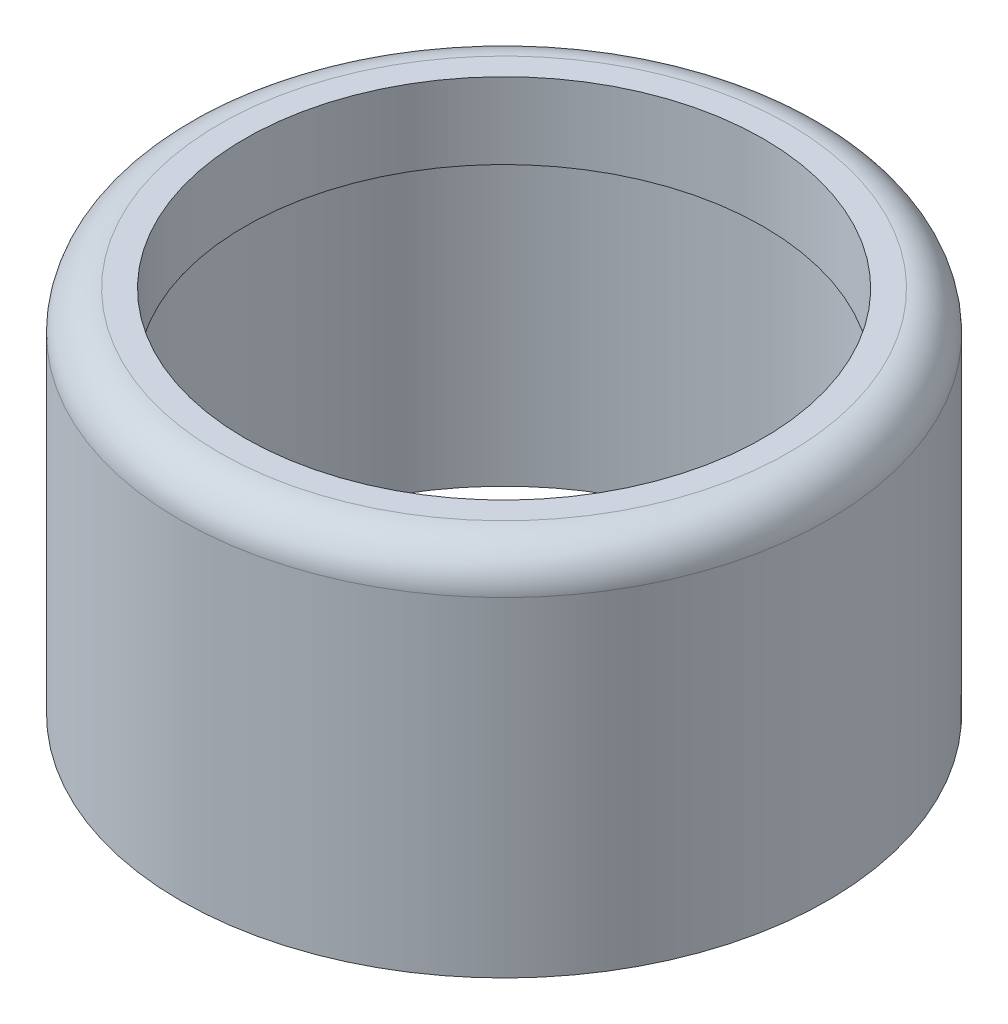
ISO-10303-21;
HEADER;
FILE_DESCRIPTION(('STEP AP214'),'2;1');
FILE_NAME('part.step','',(''),(''),'','','');
FILE_SCHEMA(('AUTOMOTIVE_DESIGN { 1 0 10303 214 1 1 1 1 }'));
ENDSEC;
DATA;
#1=APPLICATION_CONTEXT('core data for automotive mechanical design processes');
#2=APPLICATION_PROTOCOL_DEFINITION('international standard','automotive_design',2000,#1);
#3=PRODUCT_CONTEXT('',#1,'mechanical');
#4=PRODUCT('Part','Part','',(#3));
#5=PRODUCT_RELATED_PRODUCT_CATEGORY('part','',(#4));
#6=PRODUCT_DEFINITION_FORMATION('','',#4);
#7=PRODUCT_DEFINITION_CONTEXT('part definition',#1,'design');
#8=PRODUCT_DEFINITION('design','',#6,#7);
#9=PRODUCT_DEFINITION_SHAPE('','',#8);
#10=(LENGTH_UNIT() NAMED_UNIT(*) SI_UNIT(.MILLI.,.METRE.));
#11=(NAMED_UNIT(*) PLANE_ANGLE_UNIT() SI_UNIT($,.RADIAN.));
#12=(NAMED_UNIT(*) SI_UNIT($,.STERADIAN.) SOLID_ANGLE_UNIT());
#13=UNCERTAINTY_MEASURE_WITH_UNIT(LENGTH_MEASURE(1.E-05),#10,'distance_accuracy_value','');
#14=(GEOMETRIC_REPRESENTATION_CONTEXT(3) GLOBAL_UNCERTAINTY_ASSIGNED_CONTEXT((#13)) GLOBAL_UNIT_ASSIGNED_CONTEXT((#10,
#11,#12)) REPRESENTATION_CONTEXT('',''));
#15=CARTESIAN_POINT('',(0.,0.,0.));
#16=DIRECTION('',(0.,0.,1.));
#17=DIRECTION('',(1.,0.,0.));
#18=AXIS2_PLACEMENT_3D('',#15,#16,#17);
#19=CARTESIAN_POINT('',(0.,-2.9624390955405,0.));
#20=DIRECTION('',(0.,1.,0.));
#21=DIRECTION('',(0.,0.,1.));
#22=AXIS2_PLACEMENT_3D('',#19,#20,#21);
#23=TOROIDAL_SURFACE('',#22,14.6,2.);
#24=CARTESIAN_POINT('',(0.,-0.962439095540502,0.));
#25=DIRECTION('',(0.,1.,0.));
#26=DIRECTION('',(0.,0.,1.));
#27=AXIS2_PLACEMENT_3D('',#24,#25,#26);
#28=CIRCLE('',#27,14.6);
#29=CARTESIAN_POINT('',(0.,-0.962439095540502,14.6));
#30=VERTEX_POINT('',#29);
#31=EDGE_CURVE('E10',#30,#30,#28,.T.);
#32=ORIENTED_EDGE('',*,*,#31,.F.);
#33=EDGE_LOOP('',(#32));
#34=FACE_BOUND('',#33,.T.);
#35=CARTESIAN_POINT('',(0.,-2.9624390955405,0.));
#36=DIRECTION('',(0.,1.,0.));
#37=DIRECTION('',(0.,0.,1.));
#38=AXIS2_PLACEMENT_3D('',#35,#36,#37);
#39=CIRCLE('',#38,16.6);
#40=CARTESIAN_POINT('',(0.,-2.9624390955405,16.6));
#41=VERTEX_POINT('',#40);
#42=EDGE_CURVE('E65',#41,#41,#39,.T.);
#43=ORIENTED_EDGE('',*,*,#42,.T.);
#44=EDGE_LOOP('',(#43));
#45=FACE_BOUND('',#44,.T.);
#46=ADVANCED_FACE('F40',(#34,#45),#23,.T.);
#47=CARTESIAN_POINT('',(13.3,-0.962439095540502,0.));
#48=DIRECTION('',(0.,-1.,0.));
#49=DIRECTION('',(0.,0.,-1.));
#50=AXIS2_PLACEMENT_3D('',#47,#48,#49);
#51=PLANE('',#50);
#52=CARTESIAN_POINT('',(0.,-0.962439095540502,0.));
#53=DIRECTION('',(0.,1.,0.));
#54=DIRECTION('',(0.,0.,1.));
#55=AXIS2_PLACEMENT_3D('',#52,#53,#54);
#56=CIRCLE('',#55,13.3);
#57=CARTESIAN_POINT('',(0.,-0.962439095540502,13.3));
#58=VERTEX_POINT('',#57);
#59=EDGE_CURVE('E43',#58,#58,#56,.T.);
#60=ORIENTED_EDGE('',*,*,#59,.F.);
#61=EDGE_LOOP('',(#60));
#62=FACE_BOUND('',#61,.T.);
#63=ORIENTED_EDGE('',*,*,#31,.T.);
#64=EDGE_LOOP('',(#63));
#65=FACE_BOUND('',#64,.T.);
#66=ADVANCED_FACE('F91',(#62,#65),#51,.F.);
#67=CARTESIAN_POINT('',(0.,0.,0.));
#68=DIRECTION('',(0.,1.,0.));
#69=DIRECTION('',(0.,0.,1.));
#70=AXIS2_PLACEMENT_3D('',#67,#68,#69);
#71=CYLINDRICAL_SURFACE('',#70,13.3);
#72=CARTESIAN_POINT('',(0.,-4.8624390955405,0.));
#73=DIRECTION('',(0.,1.,0.));
#74=DIRECTION('',(0.,0.,1.));
#75=AXIS2_PLACEMENT_3D('',#72,#73,#74);
#76=CIRCLE('',#75,13.3);
#77=CARTESIAN_POINT('',(0.,-4.8624390955405,13.3));
#78=VERTEX_POINT('',#77);
#79=EDGE_CURVE('E50',#78,#78,#76,.T.);
#80=ORIENTED_EDGE('',*,*,#79,.F.);
#81=EDGE_LOOP('',(#80));
#82=FACE_BOUND('',#81,.T.);
#83=ORIENTED_EDGE('',*,*,#59,.T.);
#84=EDGE_LOOP('',(#83));
#85=FACE_BOUND('',#84,.T.);
#86=ADVANCED_FACE('F86',(#82,#85),#71,.F.);
#87=CARTESIAN_POINT('',(14.3,-4.8624390955405,0.));
#88=DIRECTION('',(0.,1.,0.));
#89=DIRECTION('',(0.,0.,1.));
#90=AXIS2_PLACEMENT_3D('',#87,#88,#89);
#91=PLANE('',#90);
#92=CARTESIAN_POINT('',(0.,-4.8624390955405,0.));
#93=DIRECTION('',(0.,1.,0.));
#94=DIRECTION('',(0.,0.,1.));
#95=AXIS2_PLACEMENT_3D('',#92,#93,#94);
#96=CIRCLE('',#95,14.3);
#97=CARTESIAN_POINT('',(0.,-4.8624390955405,14.3));
#98=VERTEX_POINT('',#97);
#99=EDGE_CURVE('E51',#98,#98,#96,.T.);
#100=ORIENTED_EDGE('',*,*,#99,.F.);
#101=EDGE_LOOP('',(#100));
#102=FACE_BOUND('',#101,.T.);
#103=ORIENTED_EDGE('',*,*,#79,.T.);
#104=EDGE_LOOP('',(#103));
#105=FACE_BOUND('',#104,.T.);
#106=ADVANCED_FACE('F85',(#102,#105),#91,.F.);
#107=CARTESIAN_POINT('',(0.,0.,0.));
#108=DIRECTION('',(0.,1.,0.));
#109=DIRECTION('',(0.,0.,1.));
#110=AXIS2_PLACEMENT_3D('',#107,#108,#109);
#111=CYLINDRICAL_SURFACE('',#110,14.3);
#112=CARTESIAN_POINT('',(0.,-19.8624390955405,0.));
#113=DIRECTION('',(0.,1.,0.));
#114=DIRECTION('',(0.,0.,1.));
#115=AXIS2_PLACEMENT_3D('',#112,#113,#114);
#116=CIRCLE('',#115,14.3);
#117=CARTESIAN_POINT('',(0.,-19.8624390955405,14.3));
#118=VERTEX_POINT('',#117);
#119=EDGE_CURVE('E57',#118,#118,#116,.T.);
#120=ORIENTED_EDGE('',*,*,#119,.F.);
#121=EDGE_LOOP('',(#120));
#122=FACE_BOUND('',#121,.T.);
#123=ORIENTED_EDGE('',*,*,#99,.T.);
#124=EDGE_LOOP('',(#123));
#125=FACE_BOUND('',#124,.T.);
#126=ADVANCED_FACE('F77',(#122,#125),#111,.F.);
#127=CARTESIAN_POINT('',(16.6,-19.8624390955405,0.));
#128=DIRECTION('',(0.,1.,0.));
#129=DIRECTION('',(0.,0.,1.));
#130=AXIS2_PLACEMENT_3D('',#127,#128,#129);
#131=PLANE('',#130);
#132=CARTESIAN_POINT('',(0.,-19.8624390955405,0.));
#133=DIRECTION('',(0.,1.,0.));
#134=DIRECTION('',(0.,0.,1.));
#135=AXIS2_PLACEMENT_3D('',#132,#133,#134);
#136=CIRCLE('',#135,16.6);
#137=CARTESIAN_POINT('',(0.,-19.8624390955405,16.6));
#138=VERTEX_POINT('',#137);
#139=EDGE_CURVE('E56',#138,#138,#136,.T.);
#140=ORIENTED_EDGE('',*,*,#139,.F.);
#141=EDGE_LOOP('',(#140));
#142=FACE_BOUND('',#141,.T.);
#143=ORIENTED_EDGE('',*,*,#119,.T.);
#144=EDGE_LOOP('',(#143));
#145=FACE_BOUND('',#144,.T.);
#146=ADVANCED_FACE('F69',(#142,#145),#131,.F.);
#147=CARTESIAN_POINT('',(0.,0.,0.));
#148=DIRECTION('',(0.,1.,0.));
#149=DIRECTION('',(0.,0.,1.));
#150=AXIS2_PLACEMENT_3D('',#147,#148,#149);
#151=CYLINDRICAL_SURFACE('',#150,16.6);
#152=ORIENTED_EDGE('',*,*,#42,.F.);
#153=EDGE_LOOP('',(#152));
#154=FACE_BOUND('',#153,.T.);
#155=ORIENTED_EDGE('',*,*,#139,.T.);
#156=EDGE_LOOP('',(#155));
#157=FACE_BOUND('',#156,.T.);
#158=ADVANCED_FACE('F70',(#154,#157),#151,.T.);
#159=CLOSED_SHELL('',(#46,#66,#86,#106,#126,#146,#158));
#160=MANIFOLD_SOLID_BREP('B2',#159);
#161=ADVANCED_BREP_SHAPE_REPRESENTATION('',(#18,#160),#14);
#162=SHAPE_DEFINITION_REPRESENTATION(#9,#161);
ENDSEC;
END-ISO-10303-21;
